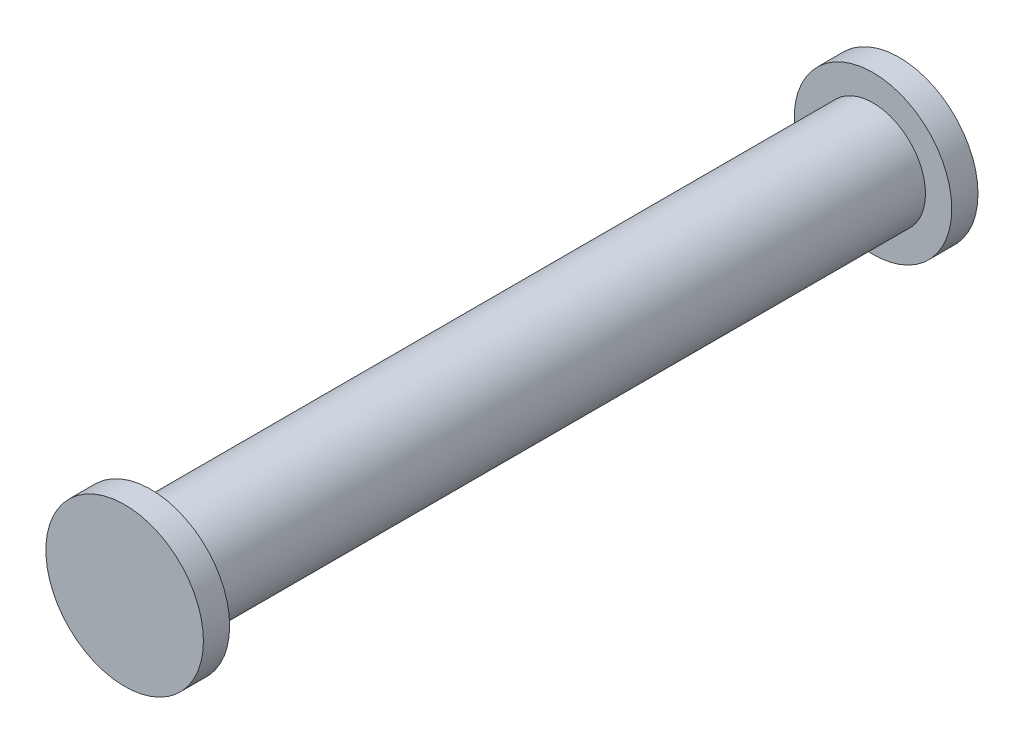
ISO-10303-21;
HEADER;
FILE_DESCRIPTION(('STEP AP214'),'2;1');
FILE_NAME('part.step','',(''),(''),'','','');
FILE_SCHEMA(('AUTOMOTIVE_DESIGN { 1 0 10303 214 1 1 1 1 }'));
ENDSEC;
DATA;
#1=APPLICATION_CONTEXT('core data for automotive mechanical design processes');
#2=APPLICATION_PROTOCOL_DEFINITION('international standard','automotive_design',2000,#1);
#3=PRODUCT_CONTEXT('',#1,'mechanical');
#4=PRODUCT('Part','Part','',(#3));
#5=PRODUCT_RELATED_PRODUCT_CATEGORY('part','',(#4));
#6=PRODUCT_DEFINITION_FORMATION('','',#4);
#7=PRODUCT_DEFINITION_CONTEXT('part definition',#1,'design');
#8=PRODUCT_DEFINITION('design','',#6,#7);
#9=PRODUCT_DEFINITION_SHAPE('','',#8);
#10=(LENGTH_UNIT() NAMED_UNIT(*) SI_UNIT(.MILLI.,.METRE.));
#11=(NAMED_UNIT(*) PLANE_ANGLE_UNIT() SI_UNIT($,.RADIAN.));
#12=(NAMED_UNIT(*) SI_UNIT($,.STERADIAN.) SOLID_ANGLE_UNIT());
#13=UNCERTAINTY_MEASURE_WITH_UNIT(LENGTH_MEASURE(1.E-05),#10,'distance_accuracy_value','');
#14=(GEOMETRIC_REPRESENTATION_CONTEXT(3) GLOBAL_UNCERTAINTY_ASSIGNED_CONTEXT((#13)) GLOBAL_UNIT_ASSIGNED_CONTEXT((#10,
#11,#12)) REPRESENTATION_CONTEXT('',''));
#15=CARTESIAN_POINT('',(0.,0.,0.));
#16=DIRECTION('',(0.,0.,1.));
#17=DIRECTION('',(1.,0.,0.));
#18=AXIS2_PLACEMENT_3D('',#15,#16,#17);
#19=CARTESIAN_POINT('',(0.,0.,27.5));
#20=DIRECTION('',(0.,0.,-1.));
#21=DIRECTION('',(-1.,0.,0.));
#22=AXIS2_PLACEMENT_3D('',#19,#20,#21);
#23=CYLINDRICAL_SURFACE('',#22,4.);
#24=CARTESIAN_POINT('',(0.,0.,27.5));
#25=DIRECTION('',(0.,0.,1.));
#26=DIRECTION('',(1.,0.,0.));
#27=AXIS2_PLACEMENT_3D('',#24,#25,#26);
#28=CIRCLE('',#27,4.);
#29=CARTESIAN_POINT('',(4.,0.,27.5));
#30=VERTEX_POINT('',#29);
#31=EDGE_CURVE('E10',#30,#30,#28,.T.);
#32=ORIENTED_EDGE('',*,*,#31,.F.);
#33=EDGE_LOOP('',(#32));
#34=FACE_BOUND('',#33,.T.);
#35=CARTESIAN_POINT('',(0.,0.,-27.5));
#36=DIRECTION('',(0.,0.,1.));
#37=DIRECTION('',(1.,0.,0.));
#38=AXIS2_PLACEMENT_3D('',#35,#36,#37);
#39=CIRCLE('',#38,4.);
#40=CARTESIAN_POINT('',(4.,0.,-27.5));
#41=VERTEX_POINT('',#40);
#42=EDGE_CURVE('E38',#41,#41,#39,.T.);
#43=ORIENTED_EDGE('',*,*,#42,.T.);
#44=EDGE_LOOP('',(#43));
#45=FACE_BOUND('',#44,.T.);
#46=ADVANCED_FACE('F35',(#34,#45),#23,.T.);
#47=CARTESIAN_POINT('',(0.,0.,29.5));
#48=DIRECTION('',(0.,0.,-1.));
#49=DIRECTION('',(-1.,0.,0.));
#50=AXIS2_PLACEMENT_3D('',#47,#48,#49);
#51=CYLINDRICAL_SURFACE('',#50,6.);
#52=CARTESIAN_POINT('',(0.,0.,29.5));
#53=DIRECTION('',(0.,0.,1.));
#54=DIRECTION('',(1.,0.,0.));
#55=AXIS2_PLACEMENT_3D('',#52,#53,#54);
#56=CIRCLE('',#55,6.);
#57=CARTESIAN_POINT('',(6.,0.,29.5));
#58=VERTEX_POINT('',#57);
#59=EDGE_CURVE('E42',#58,#58,#56,.T.);
#60=ORIENTED_EDGE('',*,*,#59,.F.);
#61=EDGE_LOOP('',(#60));
#62=FACE_BOUND('',#61,.T.);
#63=CARTESIAN_POINT('',(0.,0.,27.5));
#64=DIRECTION('',(0.,0.,1.));
#65=DIRECTION('',(1.,0.,0.));
#66=AXIS2_PLACEMENT_3D('',#63,#64,#65);
#67=CIRCLE('',#66,6.);
#68=CARTESIAN_POINT('',(6.,0.,27.5));
#69=VERTEX_POINT('',#68);
#70=EDGE_CURVE('E46',#69,#69,#67,.T.);
#71=ORIENTED_EDGE('',*,*,#70,.T.);
#72=EDGE_LOOP('',(#71));
#73=FACE_BOUND('',#72,.T.);
#74=ADVANCED_FACE('F83',(#62,#73),#51,.T.);
#75=CARTESIAN_POINT('',(0.,0.,29.5));
#76=DIRECTION('',(0.,0.,1.));
#77=DIRECTION('',(1.,0.,0.));
#78=AXIS2_PLACEMENT_3D('',#75,#76,#77);
#79=PLANE('',#78);
#80=ORIENTED_EDGE('',*,*,#59,.T.);
#81=EDGE_LOOP('',(#80));
#82=FACE_BOUND('',#81,.T.);
#83=ADVANCED_FACE('F79',(#82),#79,.T.);
#84=CARTESIAN_POINT('',(0.,0.,27.5));
#85=DIRECTION('',(0.,0.,1.));
#86=DIRECTION('',(1.,0.,0.));
#87=AXIS2_PLACEMENT_3D('',#84,#85,#86);
#88=PLANE('',#87);
#89=ORIENTED_EDGE('',*,*,#31,.T.);
#90=EDGE_LOOP('',(#89));
#91=FACE_BOUND('',#90,.T.);
#92=ORIENTED_EDGE('',*,*,#70,.F.);
#93=EDGE_LOOP('',(#92));
#94=FACE_BOUND('',#93,.T.);
#95=ADVANCED_FACE('F71',(#91,#94),#88,.F.);
#96=CARTESIAN_POINT('',(0.,0.,-29.5));
#97=DIRECTION('',(0.,0.,1.));
#98=DIRECTION('',(1.,0.,0.));
#99=AXIS2_PLACEMENT_3D('',#96,#97,#98);
#100=CYLINDRICAL_SURFACE('',#99,6.);
#101=CARTESIAN_POINT('',(0.,0.,-29.5));
#102=DIRECTION('',(0.,0.,1.));
#103=DIRECTION('',(1.,0.,0.));
#104=AXIS2_PLACEMENT_3D('',#101,#102,#103);
#105=CIRCLE('',#104,6.);
#106=CARTESIAN_POINT('',(6.,0.,-29.5));
#107=VERTEX_POINT('',#106);
#108=EDGE_CURVE('E54',#107,#107,#105,.T.);
#109=ORIENTED_EDGE('',*,*,#108,.T.);
#110=EDGE_LOOP('',(#109));
#111=FACE_BOUND('',#110,.T.);
#112=CARTESIAN_POINT('',(0.,0.,-27.5));
#113=DIRECTION('',(0.,0.,1.));
#114=DIRECTION('',(1.,0.,0.));
#115=AXIS2_PLACEMENT_3D('',#112,#113,#114);
#116=CIRCLE('',#115,6.);
#117=CARTESIAN_POINT('',(6.,0.,-27.5));
#118=VERTEX_POINT('',#117);
#119=EDGE_CURVE('E51',#118,#118,#116,.T.);
#120=ORIENTED_EDGE('',*,*,#119,.F.);
#121=EDGE_LOOP('',(#120));
#122=FACE_BOUND('',#121,.T.);
#123=ADVANCED_FACE('F69',(#111,#122),#100,.T.);
#124=CARTESIAN_POINT('',(0.,0.,-29.5));
#125=DIRECTION('',(0.,0.,-1.));
#126=DIRECTION('',(1.,0.,0.));
#127=AXIS2_PLACEMENT_3D('',#124,#125,#126);
#128=PLANE('',#127);
#129=ORIENTED_EDGE('',*,*,#108,.F.);
#130=EDGE_LOOP('',(#129));
#131=FACE_BOUND('',#130,.T.);
#132=ADVANCED_FACE('F65',(#131),#128,.T.);
#133=CARTESIAN_POINT('',(0.,0.,-27.5));
#134=DIRECTION('',(0.,0.,-1.));
#135=DIRECTION('',(1.,0.,0.));
#136=AXIS2_PLACEMENT_3D('',#133,#134,#135);
#137=PLANE('',#136);
#138=ORIENTED_EDGE('',*,*,#42,.F.);
#139=EDGE_LOOP('',(#138));
#140=FACE_BOUND('',#139,.T.);
#141=ORIENTED_EDGE('',*,*,#119,.T.);
#142=EDGE_LOOP('',(#141));
#143=FACE_BOUND('',#142,.T.);
#144=ADVANCED_FACE('F62',(#140,#143),#137,.F.);
#145=CLOSED_SHELL('',(#46,#74,#83,#95,#123,#132,#144));
#146=MANIFOLD_SOLID_BREP('B2',#145);
#147=ADVANCED_BREP_SHAPE_REPRESENTATION('',(#18,#146),#14);
#148=SHAPE_DEFINITION_REPRESENTATION(#9,#147);
ENDSEC;
END-ISO-10303-21;
